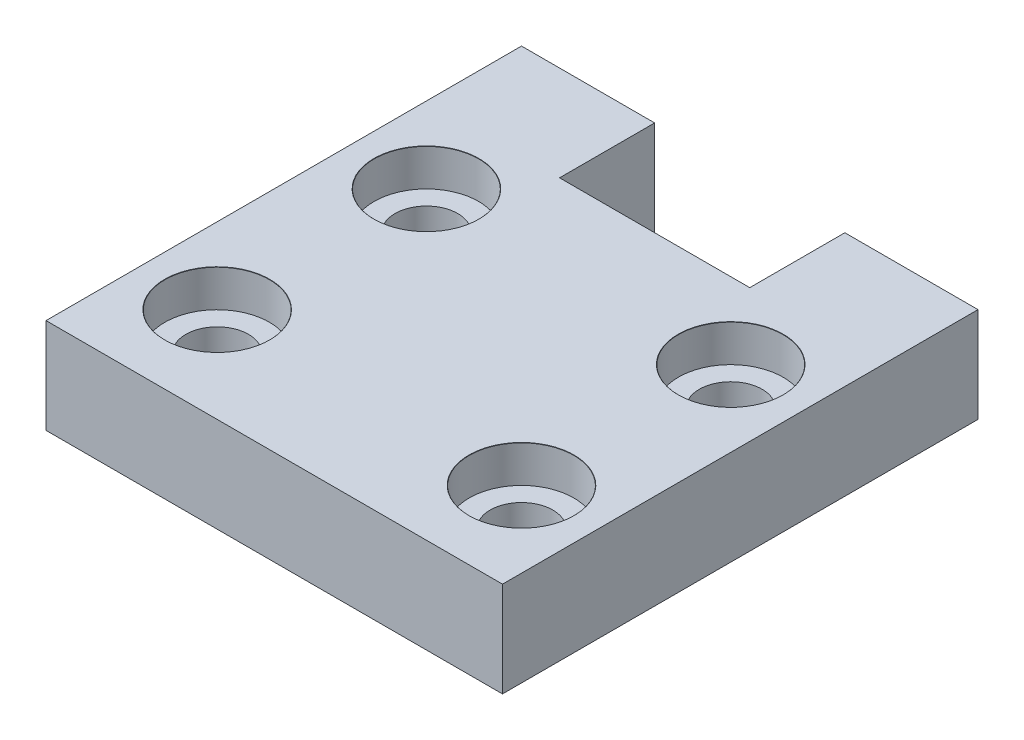
ISO-10303-21;
HEADER;
FILE_DESCRIPTION(('STEP AP214'),'2;1');
FILE_NAME('part.step','',(''),(''),'','','');
FILE_SCHEMA(('AUTOMOTIVE_DESIGN { 1 0 10303 214 1 1 1 1 }'));
ENDSEC;
DATA;
#1=APPLICATION_CONTEXT('core data for automotive mechanical design processes');
#2=APPLICATION_PROTOCOL_DEFINITION('international standard','automotive_design',2000,#1);
#3=PRODUCT_CONTEXT('',#1,'mechanical');
#4=PRODUCT('Part','Part','',(#3));
#5=PRODUCT_RELATED_PRODUCT_CATEGORY('part','',(#4));
#6=PRODUCT_DEFINITION_FORMATION('','',#4);
#7=PRODUCT_DEFINITION_CONTEXT('part definition',#1,'design');
#8=PRODUCT_DEFINITION('design','',#6,#7);
#9=PRODUCT_DEFINITION_SHAPE('','',#8);
#10=(LENGTH_UNIT() NAMED_UNIT(*) SI_UNIT(.MILLI.,.METRE.));
#11=(NAMED_UNIT(*) PLANE_ANGLE_UNIT() SI_UNIT($,.RADIAN.));
#12=(NAMED_UNIT(*) SI_UNIT($,.STERADIAN.) SOLID_ANGLE_UNIT());
#13=UNCERTAINTY_MEASURE_WITH_UNIT(LENGTH_MEASURE(1.E-05),#10,'distance_accuracy_value','');
#14=(GEOMETRIC_REPRESENTATION_CONTEXT(3) GLOBAL_UNCERTAINTY_ASSIGNED_CONTEXT((#13)) GLOBAL_UNIT_ASSIGNED_CONTEXT((#10,
#11,#12)) REPRESENTATION_CONTEXT('',''));
#15=CARTESIAN_POINT('',(0.,0.,0.));
#16=DIRECTION('',(0.,0.,1.));
#17=DIRECTION('',(1.,0.,0.));
#18=AXIS2_PLACEMENT_3D('',#15,#16,#17);
#19=CARTESIAN_POINT('',(-24.,10.,-25.));
#20=DIRECTION('',(0.,0.,1.));
#21=DIRECTION('',(1.,0.,0.));
#22=AXIS2_PLACEMENT_3D('',#19,#20,#21);
#23=PLANE('',#22);
#24=DIRECTION('',(-1.,0.,0.));
#25=VECTOR('',#24,1.);
#26=CARTESIAN_POINT('',(-24.,0.,-25.));
#27=LINE('',#26,#25);
#28=CARTESIAN_POINT('',(24.,0.,-25.));
#29=VERTEX_POINT('',#28);
#30=CARTESIAN_POINT('',(10.,0.,-25.));
#31=VERTEX_POINT('',#30);
#32=EDGE_CURVE('E152',#29,#31,#27,.T.);
#33=ORIENTED_EDGE('',*,*,#32,.T.);
#34=DIRECTION('',(0.,1.,0.));
#35=VECTOR('',#34,1.);
#36=CARTESIAN_POINT('',(9.99999999999999,10.,-25.));
#37=LINE('',#36,#35);
#38=CARTESIAN_POINT('',(10.,10.,-25.));
#39=VERTEX_POINT('',#38);
#40=EDGE_CURVE('E121',#31,#39,#37,.T.);
#41=ORIENTED_EDGE('',*,*,#40,.T.);
#42=DIRECTION('',(-1.,0.,0.));
#43=VECTOR('',#42,1.);
#44=CARTESIAN_POINT('',(-24.,10.,-25.));
#45=LINE('',#44,#43);
#46=CARTESIAN_POINT('',(24.,10.,-25.));
#47=VERTEX_POINT('',#46);
#48=EDGE_CURVE('E86',#47,#39,#45,.T.);
#49=ORIENTED_EDGE('',*,*,#48,.F.);
#50=DIRECTION('',(0.,-1.,0.));
#51=VECTOR('',#50,1.);
#52=CARTESIAN_POINT('',(24.,10.,-25.));
#53=LINE('',#52,#51);
#54=EDGE_CURVE('E41',#47,#29,#53,.T.);
#55=ORIENTED_EDGE('',*,*,#54,.T.);
#56=EDGE_LOOP('',(#33,#41,#49,#55));
#57=FACE_BOUND('',#56,.T.);
#58=ADVANCED_FACE('F33',(#57),#23,.F.);
#59=CARTESIAN_POINT('',(24.,10.,-25.));
#60=DIRECTION('',(-1.,0.,0.));
#61=DIRECTION('',(0.,0.,1.));
#62=AXIS2_PLACEMENT_3D('',#59,#60,#61);
#63=PLANE('',#62);
#64=DIRECTION('',(0.,0.,-1.));
#65=VECTOR('',#64,1.);
#66=CARTESIAN_POINT('',(24.,0.,-25.));
#67=LINE('',#66,#65);
#68=CARTESIAN_POINT('',(24.,0.,25.));
#69=VERTEX_POINT('',#68);
#70=EDGE_CURVE('E140',#69,#29,#67,.T.);
#71=ORIENTED_EDGE('',*,*,#70,.T.);
#72=ORIENTED_EDGE('',*,*,#54,.F.);
#73=DIRECTION('',(0.,0.,-1.));
#74=VECTOR('',#73,1.);
#75=CARTESIAN_POINT('',(24.,10.,-25.));
#76=LINE('',#75,#74);
#77=CARTESIAN_POINT('',(24.,10.,25.));
#78=VERTEX_POINT('',#77);
#79=EDGE_CURVE('E141',#78,#47,#76,.T.);
#80=ORIENTED_EDGE('',*,*,#79,.F.);
#81=DIRECTION('',(0.,-1.,0.));
#82=VECTOR('',#81,1.);
#83=CARTESIAN_POINT('',(24.,10.,25.));
#84=LINE('',#83,#82);
#85=EDGE_CURVE('E148',#78,#69,#84,.T.);
#86=ORIENTED_EDGE('',*,*,#85,.T.);
#87=EDGE_LOOP('',(#71,#72,#80,#86));
#88=FACE_BOUND('',#87,.T.);
#89=ADVANCED_FACE('F35',(#88),#63,.F.);
#90=CARTESIAN_POINT('',(-10.,10.,-25.));
#91=VERTEX_POINT('',#90);
#92=CARTESIAN_POINT('',(-24.,10.,-25.));
#93=VERTEX_POINT('',#92);
#94=EDGE_CURVE('E143',#91,#93,#45,.T.);
#95=ORIENTED_EDGE('',*,*,#94,.F.);
#96=DIRECTION('',(0.,-1.,0.));
#97=VECTOR('',#96,1.);
#98=CARTESIAN_POINT('',(-10.,10.,-25.));
#99=LINE('',#98,#97);
#100=CARTESIAN_POINT('',(-10.,0.,-25.));
#101=VERTEX_POINT('',#100);
#102=EDGE_CURVE('E115',#91,#101,#99,.T.);
#103=ORIENTED_EDGE('',*,*,#102,.T.);
#104=CARTESIAN_POINT('',(-24.,0.,-25.));
#105=VERTEX_POINT('',#104);
#106=EDGE_CURVE('E151',#101,#105,#27,.T.);
#107=ORIENTED_EDGE('',*,*,#106,.T.);
#108=DIRECTION('',(0.,-1.,0.));
#109=VECTOR('',#108,1.);
#110=CARTESIAN_POINT('',(-24.,10.,-25.));
#111=LINE('',#110,#109);
#112=EDGE_CURVE('E160',#93,#105,#111,.T.);
#113=ORIENTED_EDGE('',*,*,#112,.F.);
#114=EDGE_LOOP('',(#95,#103,#107,#113));
#115=FACE_BOUND('',#114,.T.);
#116=ADVANCED_FACE('F178',(#115),#23,.F.);
#117=CARTESIAN_POINT('',(-24.,10.,-25.));
#118=DIRECTION('',(1.,0.,0.));
#119=DIRECTION('',(0.,0.,-1.));
#120=AXIS2_PLACEMENT_3D('',#117,#118,#119);
#121=PLANE('',#120);
#122=DIRECTION('',(0.,0.,1.));
#123=VECTOR('',#122,1.);
#124=CARTESIAN_POINT('',(-24.,0.,-25.));
#125=LINE('',#124,#123);
#126=CARTESIAN_POINT('',(-24.,0.,25.));
#127=VERTEX_POINT('',#126);
#128=EDGE_CURVE('E154',#105,#127,#125,.T.);
#129=ORIENTED_EDGE('',*,*,#128,.T.);
#130=DIRECTION('',(0.,-1.,0.));
#131=VECTOR('',#130,1.);
#132=CARTESIAN_POINT('',(-24.,10.,25.));
#133=LINE('',#132,#131);
#134=CARTESIAN_POINT('',(-24.,10.,25.));
#135=VERTEX_POINT('',#134);
#136=EDGE_CURVE('E158',#135,#127,#133,.T.);
#137=ORIENTED_EDGE('',*,*,#136,.F.);
#138=DIRECTION('',(0.,0.,1.));
#139=VECTOR('',#138,1.);
#140=CARTESIAN_POINT('',(-24.,10.,-25.));
#141=LINE('',#140,#139);
#142=EDGE_CURVE('E145',#93,#135,#141,.T.);
#143=ORIENTED_EDGE('',*,*,#142,.F.);
#144=ORIENTED_EDGE('',*,*,#112,.T.);
#145=EDGE_LOOP('',(#129,#137,#143,#144));
#146=FACE_BOUND('',#145,.T.);
#147=ADVANCED_FACE('F169',(#146),#121,.F.);
#148=CARTESIAN_POINT('',(-24.,10.,25.));
#149=DIRECTION('',(0.,0.,-1.));
#150=DIRECTION('',(-1.,0.,0.));
#151=AXIS2_PLACEMENT_3D('',#148,#149,#150);
#152=PLANE('',#151);
#153=DIRECTION('',(1.,0.,0.));
#154=VECTOR('',#153,1.);
#155=CARTESIAN_POINT('',(-24.,0.,25.));
#156=LINE('',#155,#154);
#157=EDGE_CURVE('E78',#127,#69,#156,.T.);
#158=ORIENTED_EDGE('',*,*,#157,.T.);
#159=ORIENTED_EDGE('',*,*,#85,.F.);
#160=DIRECTION('',(1.,0.,0.));
#161=VECTOR('',#160,1.);
#162=CARTESIAN_POINT('',(-24.,10.,25.));
#163=LINE('',#162,#161);
#164=EDGE_CURVE('E57',#135,#78,#163,.T.);
#165=ORIENTED_EDGE('',*,*,#164,.F.);
#166=ORIENTED_EDGE('',*,*,#136,.T.);
#167=EDGE_LOOP('',(#158,#159,#165,#166));
#168=FACE_BOUND('',#167,.T.);
#169=ADVANCED_FACE('F172',(#168),#152,.F.);
#170=CARTESIAN_POINT('',(0.,10.,0.));
#171=DIRECTION('',(0.,1.,0.));
#172=DIRECTION('',(0.,0.,1.));
#173=AXIS2_PLACEMENT_3D('',#170,#171,#172);
#174=PLANE('',#173);
#175=CARTESIAN_POINT('',(-16.,10.,-7.));
#176=DIRECTION('',(0.,1.,0.));
#177=DIRECTION('',(0.,0.,1.));
#178=AXIS2_PLACEMENT_3D('',#175,#176,#177);
#179=CIRCLE('',#178,5.525);
#180=CARTESIAN_POINT('',(-16.,10.,-1.475));
#181=VERTEX_POINT('',#180);
#182=EDGE_CURVE('E213',#181,#181,#179,.T.);
#183=ORIENTED_EDGE('',*,*,#182,.F.);
#184=EDGE_LOOP('',(#183));
#185=FACE_BOUND('',#184,.T.);
#186=CARTESIAN_POINT('',(-16.,10.,15.));
#187=DIRECTION('',(0.,1.,0.));
#188=DIRECTION('',(0.,0.,1.));
#189=AXIS2_PLACEMENT_3D('',#186,#187,#188);
#190=CIRCLE('',#189,5.525);
#191=CARTESIAN_POINT('',(-16.,10.,20.525));
#192=VERTEX_POINT('',#191);
#193=EDGE_CURVE('E217',#192,#192,#190,.T.);
#194=ORIENTED_EDGE('',*,*,#193,.F.);
#195=EDGE_LOOP('',(#194));
#196=FACE_BOUND('',#195,.T.);
#197=CARTESIAN_POINT('',(16.,10.,15.));
#198=DIRECTION('',(0.,1.,0.));
#199=DIRECTION('',(0.,0.,1.));
#200=AXIS2_PLACEMENT_3D('',#197,#198,#199);
#201=CIRCLE('',#200,5.525);
#202=CARTESIAN_POINT('',(16.,10.,20.525));
#203=VERTEX_POINT('',#202);
#204=EDGE_CURVE('E221',#203,#203,#201,.T.);
#205=ORIENTED_EDGE('',*,*,#204,.F.);
#206=EDGE_LOOP('',(#205));
#207=FACE_BOUND('',#206,.T.);
#208=CARTESIAN_POINT('',(16.,10.,-7.00000000000001));
#209=DIRECTION('',(0.,1.,0.));
#210=DIRECTION('',(0.,0.,1.));
#211=AXIS2_PLACEMENT_3D('',#208,#209,#210);
#212=CIRCLE('',#211,5.525);
#213=CARTESIAN_POINT('',(16.,10.,-1.475));
#214=VERTEX_POINT('',#213);
#215=EDGE_CURVE('E224',#214,#214,#212,.T.);
#216=ORIENTED_EDGE('',*,*,#215,.F.);
#217=EDGE_LOOP('',(#216));
#218=FACE_BOUND('',#217,.T.);
#219=DIRECTION('',(0.,0.,-1.));
#220=VECTOR('',#219,1.);
#221=CARTESIAN_POINT('',(10.,10.,-35.));
#222=LINE('',#221,#220);
#223=CARTESIAN_POINT('',(10.,10.,-15.));
#224=VERTEX_POINT('',#223);
#225=EDGE_CURVE('E131',#224,#39,#222,.T.);
#226=ORIENTED_EDGE('',*,*,#225,.F.);
#227=DIRECTION('',(1.,0.,0.));
#228=VECTOR('',#227,1.);
#229=CARTESIAN_POINT('',(-10.,10.,-15.));
#230=LINE('',#229,#228);
#231=CARTESIAN_POINT('',(-10.,10.,-15.));
#232=VERTEX_POINT('',#231);
#233=EDGE_CURVE('E112',#232,#224,#230,.T.);
#234=ORIENTED_EDGE('',*,*,#233,.F.);
#235=DIRECTION('',(0.,0.,1.));
#236=VECTOR('',#235,1.);
#237=CARTESIAN_POINT('',(-10.,10.,-35.));
#238=LINE('',#237,#236);
#239=EDGE_CURVE('E133',#91,#232,#238,.T.);
#240=ORIENTED_EDGE('',*,*,#239,.F.);
#241=ORIENTED_EDGE('',*,*,#94,.T.);
#242=ORIENTED_EDGE('',*,*,#142,.T.);
#243=ORIENTED_EDGE('',*,*,#164,.T.);
#244=ORIENTED_EDGE('',*,*,#79,.T.);
#245=ORIENTED_EDGE('',*,*,#48,.T.);
#246=EDGE_LOOP('',(#226,#234,#240,#241,#242,#243,#244,#245));
#247=FACE_BOUND('',#246,.T.);
#248=ADVANCED_FACE('F173',(#185,#196,#207,#218,#247),#174,.T.);
#249=CARTESIAN_POINT('',(0.,0.,0.));
#250=DIRECTION('',(0.,1.,0.));
#251=DIRECTION('',(0.,0.,1.));
#252=AXIS2_PLACEMENT_3D('',#249,#250,#251);
#253=PLANE('',#252);
#254=CARTESIAN_POINT('',(-16.,0.,-7.));
#255=DIRECTION('',(0.,1.,0.));
#256=DIRECTION('',(0.,0.,1.));
#257=AXIS2_PLACEMENT_3D('',#254,#255,#256);
#258=CIRCLE('',#257,3.3);
#259=CARTESIAN_POINT('',(-16.,0.,-3.70000000000001));
#260=VERTEX_POINT('',#259);
#261=EDGE_CURVE('E330',#260,#260,#258,.T.);
#262=ORIENTED_EDGE('',*,*,#261,.T.);
#263=EDGE_LOOP('',(#262));
#264=FACE_BOUND('',#263,.T.);
#265=CARTESIAN_POINT('',(-16.,0.,15.));
#266=DIRECTION('',(0.,1.,0.));
#267=DIRECTION('',(0.,0.,1.));
#268=AXIS2_PLACEMENT_3D('',#265,#266,#267);
#269=CIRCLE('',#268,3.3);
#270=CARTESIAN_POINT('',(-16.,0.,18.3));
#271=VERTEX_POINT('',#270);
#272=EDGE_CURVE('E343',#271,#271,#269,.T.);
#273=ORIENTED_EDGE('',*,*,#272,.T.);
#274=EDGE_LOOP('',(#273));
#275=FACE_BOUND('',#274,.T.);
#276=CARTESIAN_POINT('',(16.,0.,15.));
#277=DIRECTION('',(0.,1.,0.));
#278=DIRECTION('',(0.,0.,1.));
#279=AXIS2_PLACEMENT_3D('',#276,#277,#278);
#280=CIRCLE('',#279,3.3);
#281=CARTESIAN_POINT('',(16.,0.,18.3));
#282=VERTEX_POINT('',#281);
#283=EDGE_CURVE('E227',#282,#282,#280,.T.);
#284=ORIENTED_EDGE('',*,*,#283,.T.);
#285=EDGE_LOOP('',(#284));
#286=FACE_BOUND('',#285,.T.);
#287=CARTESIAN_POINT('',(16.,0.,-7.00000000000001));
#288=DIRECTION('',(0.,1.,0.));
#289=DIRECTION('',(0.,0.,1.));
#290=AXIS2_PLACEMENT_3D('',#287,#288,#289);
#291=CIRCLE('',#290,3.3);
#292=CARTESIAN_POINT('',(16.,0.,-3.70000000000001));
#293=VERTEX_POINT('',#292);
#294=EDGE_CURVE('E134',#293,#293,#291,.T.);
#295=ORIENTED_EDGE('',*,*,#294,.T.);
#296=EDGE_LOOP('',(#295));
#297=FACE_BOUND('',#296,.T.);
#298=DIRECTION('',(1.,0.,0.));
#299=VECTOR('',#298,1.);
#300=CARTESIAN_POINT('',(-10.,0.,-15.));
#301=LINE('',#300,#299);
#302=CARTESIAN_POINT('',(-10.,0.,-15.));
#303=VERTEX_POINT('',#302);
#304=CARTESIAN_POINT('',(10.,0.,-15.));
#305=VERTEX_POINT('',#304);
#306=EDGE_CURVE('E48',#303,#305,#301,.T.);
#307=ORIENTED_EDGE('',*,*,#306,.T.);
#308=DIRECTION('',(0.,0.,-1.));
#309=VECTOR('',#308,1.);
#310=CARTESIAN_POINT('',(10.,0.,-35.));
#311=LINE('',#310,#309);
#312=EDGE_CURVE('E119',#305,#31,#311,.T.);
#313=ORIENTED_EDGE('',*,*,#312,.T.);
#314=ORIENTED_EDGE('',*,*,#32,.F.);
#315=ORIENTED_EDGE('',*,*,#70,.F.);
#316=ORIENTED_EDGE('',*,*,#157,.F.);
#317=ORIENTED_EDGE('',*,*,#128,.F.);
#318=ORIENTED_EDGE('',*,*,#106,.F.);
#319=DIRECTION('',(0.,0.,1.));
#320=VECTOR('',#319,1.);
#321=CARTESIAN_POINT('',(-10.,0.,0.));
#322=LINE('',#321,#320);
#323=EDGE_CURVE('E11',#101,#303,#322,.T.);
#324=ORIENTED_EDGE('',*,*,#323,.T.);
#325=EDGE_LOOP('',(#307,#313,#314,#315,#316,#317,#318,#324));
#326=FACE_BOUND('',#325,.T.);
#327=ADVANCED_FACE('F125',(#264,#275,#286,#297,#326),#253,.F.);
#328=CARTESIAN_POINT('',(10.,0.,-35.));
#329=DIRECTION('',(1.,0.,0.));
#330=DIRECTION('',(0.,0.,-1.));
#331=AXIS2_PLACEMENT_3D('',#328,#329,#330);
#332=PLANE('',#331);
#333=ORIENTED_EDGE('',*,*,#312,.F.);
#334=DIRECTION('',(0.,1.,0.));
#335=VECTOR('',#334,1.);
#336=CARTESIAN_POINT('',(10.,0.,-15.));
#337=LINE('',#336,#335);
#338=EDGE_CURVE('E108',#305,#224,#337,.T.);
#339=ORIENTED_EDGE('',*,*,#338,.T.);
#340=ORIENTED_EDGE('',*,*,#225,.T.);
#341=ORIENTED_EDGE('',*,*,#40,.F.);
#342=EDGE_LOOP('',(#333,#339,#340,#341));
#343=FACE_BOUND('',#342,.T.);
#344=ADVANCED_FACE('F120',(#343),#332,.F.);
#345=CARTESIAN_POINT('',(-10.,0.,-35.));
#346=DIRECTION('',(-1.,0.,0.));
#347=DIRECTION('',(0.,0.,1.));
#348=AXIS2_PLACEMENT_3D('',#345,#346,#347);
#349=PLANE('',#348);
#350=ORIENTED_EDGE('',*,*,#239,.T.);
#351=DIRECTION('',(0.,1.,0.));
#352=VECTOR('',#351,1.);
#353=CARTESIAN_POINT('',(-10.,0.,-15.));
#354=LINE('',#353,#352);
#355=EDGE_CURVE('E116',#303,#232,#354,.T.);
#356=ORIENTED_EDGE('',*,*,#355,.F.);
#357=ORIENTED_EDGE('',*,*,#323,.F.);
#358=ORIENTED_EDGE('',*,*,#102,.F.);
#359=EDGE_LOOP('',(#350,#356,#357,#358));
#360=FACE_BOUND('',#359,.T.);
#361=ADVANCED_FACE('F179',(#360),#349,.F.);
#362=CARTESIAN_POINT('',(-10.,0.,-15.));
#363=DIRECTION('',(0.,0.,1.));
#364=DIRECTION('',(1.,0.,0.));
#365=AXIS2_PLACEMENT_3D('',#362,#363,#364);
#366=PLANE('',#365);
#367=ORIENTED_EDGE('',*,*,#233,.T.);
#368=ORIENTED_EDGE('',*,*,#338,.F.);
#369=ORIENTED_EDGE('',*,*,#306,.F.);
#370=ORIENTED_EDGE('',*,*,#355,.T.);
#371=EDGE_LOOP('',(#367,#368,#369,#370));
#372=FACE_BOUND('',#371,.T.);
#373=ADVANCED_FACE('F110',(#372),#366,.F.);
#374=CARTESIAN_POINT('',(16.,10.,-7.00000000000001));
#375=DIRECTION('',(0.,1.,0.));
#376=DIRECTION('',(0.,0.,1.));
#377=AXIS2_PLACEMENT_3D('',#374,#375,#376);
#378=CYLINDRICAL_SURFACE('',#377,3.3);
#379=ORIENTED_EDGE('',*,*,#294,.F.);
#380=EDGE_LOOP('',(#379));
#381=FACE_BOUND('',#380,.T.);
#382=CARTESIAN_POINT('',(16.,6.1,-7.00000000000001));
#383=DIRECTION('',(0.,1.,0.));
#384=DIRECTION('',(0.,0.,1.));
#385=AXIS2_PLACEMENT_3D('',#382,#383,#384);
#386=CIRCLE('',#385,3.3);
#387=CARTESIAN_POINT('',(16.,6.1,-3.70000000000001));
#388=VERTEX_POINT('',#387);
#389=EDGE_CURVE('E239',#388,#388,#386,.T.);
#390=ORIENTED_EDGE('',*,*,#389,.T.);
#391=EDGE_LOOP('',(#390));
#392=FACE_BOUND('',#391,.T.);
#393=ADVANCED_FACE('F186',(#381,#392),#378,.F.);
#394=CARTESIAN_POINT('',(19.3,6.1,-7.00000000000001));
#395=DIRECTION('',(0.,-1.,0.));
#396=DIRECTION('',(0.,0.,-1.));
#397=AXIS2_PLACEMENT_3D('',#394,#395,#396);
#398=PLANE('',#397);
#399=ORIENTED_EDGE('',*,*,#389,.F.);
#400=EDGE_LOOP('',(#399));
#401=FACE_BOUND('',#400,.T.);
#402=CARTESIAN_POINT('',(16.,6.1,-7.00000000000001));
#403=DIRECTION('',(0.,1.,0.));
#404=DIRECTION('',(0.,0.,1.));
#405=AXIS2_PLACEMENT_3D('',#402,#403,#404);
#406=CIRCLE('',#405,5.5);
#407=CARTESIAN_POINT('',(16.,6.1,-1.50000000000001));
#408=VERTEX_POINT('',#407);
#409=EDGE_CURVE('E230',#408,#408,#406,.T.);
#410=ORIENTED_EDGE('',*,*,#409,.T.);
#411=EDGE_LOOP('',(#410));
#412=FACE_BOUND('',#411,.T.);
#413=ADVANCED_FACE('F247',(#401,#412),#398,.F.);
#414=CARTESIAN_POINT('',(16.,10.,-7.00000000000001));
#415=DIRECTION('',(0.,1.,0.));
#416=DIRECTION('',(0.,0.,1.));
#417=AXIS2_PLACEMENT_3D('',#414,#415,#416);
#418=CYLINDRICAL_SURFACE('',#417,5.5);
#419=ORIENTED_EDGE('',*,*,#409,.F.);
#420=EDGE_LOOP('',(#419));
#421=FACE_BOUND('',#420,.T.);
#422=CARTESIAN_POINT('',(16.,9.975,-7.00000000000001));
#423=DIRECTION('',(0.,1.,0.));
#424=DIRECTION('',(0.,0.,1.));
#425=AXIS2_PLACEMENT_3D('',#422,#423,#424);
#426=CIRCLE('',#425,5.5);
#427=CARTESIAN_POINT('',(16.,9.975,-1.50000000000001));
#428=VERTEX_POINT('',#427);
#429=EDGE_CURVE('E226',#428,#428,#426,.T.);
#430=ORIENTED_EDGE('',*,*,#429,.T.);
#431=EDGE_LOOP('',(#430));
#432=FACE_BOUND('',#431,.T.);
#433=ADVANCED_FACE('F253',(#421,#432),#418,.F.);
#434=CARTESIAN_POINT('',(16.,10.,-7.00000000000001));
#435=DIRECTION('',(0.,1.,0.));
#436=DIRECTION('',(0.,0.,1.));
#437=AXIS2_PLACEMENT_3D('',#434,#435,#436);
#438=CONICAL_SURFACE('',#437,5.525,0.785398163397518);
#439=ORIENTED_EDGE('',*,*,#429,.F.);
#440=EDGE_LOOP('',(#439));
#441=FACE_BOUND('',#440,.T.);
#442=ORIENTED_EDGE('',*,*,#215,.T.);
#443=EDGE_LOOP('',(#442));
#444=FACE_BOUND('',#443,.T.);
#445=ADVANCED_FACE('F259',(#441,#444),#438,.F.);
#446=CARTESIAN_POINT('',(16.,10.,15.));
#447=DIRECTION('',(0.,1.,0.));
#448=DIRECTION('',(0.,0.,1.));
#449=AXIS2_PLACEMENT_3D('',#446,#447,#448);
#450=CYLINDRICAL_SURFACE('',#449,3.3);
#451=ORIENTED_EDGE('',*,*,#283,.F.);
#452=EDGE_LOOP('',(#451));
#453=FACE_BOUND('',#452,.T.);
#454=CARTESIAN_POINT('',(16.,6.1,15.));
#455=DIRECTION('',(0.,1.,0.));
#456=DIRECTION('',(0.,0.,1.));
#457=AXIS2_PLACEMENT_3D('',#454,#455,#456);
#458=CIRCLE('',#457,3.3);
#459=CARTESIAN_POINT('',(16.,6.1,18.3));
#460=VERTEX_POINT('',#459);
#461=EDGE_CURVE('E233',#460,#460,#458,.T.);
#462=ORIENTED_EDGE('',*,*,#461,.T.);
#463=EDGE_LOOP('',(#462));
#464=FACE_BOUND('',#463,.T.);
#465=ADVANCED_FACE('F264',(#453,#464),#450,.F.);
#466=CARTESIAN_POINT('',(19.3,6.1,15.));
#467=DIRECTION('',(0.,-1.,0.));
#468=DIRECTION('',(0.,0.,-1.));
#469=AXIS2_PLACEMENT_3D('',#466,#467,#468);
#470=PLANE('',#469);
#471=ORIENTED_EDGE('',*,*,#461,.F.);
#472=EDGE_LOOP('',(#471));
#473=FACE_BOUND('',#472,.T.);
#474=CARTESIAN_POINT('',(16.,6.1,15.));
#475=DIRECTION('',(0.,1.,0.));
#476=DIRECTION('',(0.,0.,1.));
#477=AXIS2_PLACEMENT_3D('',#474,#475,#476);
#478=CIRCLE('',#477,5.5);
#479=CARTESIAN_POINT('',(16.,6.1,20.5));
#480=VERTEX_POINT('',#479);
#481=EDGE_CURVE('E350',#480,#480,#478,.T.);
#482=ORIENTED_EDGE('',*,*,#481,.T.);
#483=EDGE_LOOP('',(#482));
#484=FACE_BOUND('',#483,.T.);
#485=ADVANCED_FACE('F269',(#473,#484),#470,.F.);
#486=CARTESIAN_POINT('',(16.,10.,15.));
#487=DIRECTION('',(0.,1.,0.));
#488=DIRECTION('',(0.,0.,1.));
#489=AXIS2_PLACEMENT_3D('',#486,#487,#488);
#490=CYLINDRICAL_SURFACE('',#489,5.5);
#491=ORIENTED_EDGE('',*,*,#481,.F.);
#492=EDGE_LOOP('',(#491));
#493=FACE_BOUND('',#492,.T.);
#494=CARTESIAN_POINT('',(16.,9.975,15.));
#495=DIRECTION('',(0.,1.,0.));
#496=DIRECTION('',(0.,0.,1.));
#497=AXIS2_PLACEMENT_3D('',#494,#495,#496);
#498=CIRCLE('',#497,5.5);
#499=CARTESIAN_POINT('',(16.,9.975,20.5));
#500=VERTEX_POINT('',#499);
#501=EDGE_CURVE('E347',#500,#500,#498,.T.);
#502=ORIENTED_EDGE('',*,*,#501,.T.);
#503=EDGE_LOOP('',(#502));
#504=FACE_BOUND('',#503,.T.);
#505=ADVANCED_FACE('F275',(#493,#504),#490,.F.);
#506=CARTESIAN_POINT('',(16.,10.,15.));
#507=DIRECTION('',(0.,1.,0.));
#508=DIRECTION('',(0.,0.,1.));
#509=AXIS2_PLACEMENT_3D('',#506,#507,#508);
#510=CONICAL_SURFACE('',#509,5.525,0.785398163397518);
#511=ORIENTED_EDGE('',*,*,#501,.F.);
#512=EDGE_LOOP('',(#511));
#513=FACE_BOUND('',#512,.T.);
#514=ORIENTED_EDGE('',*,*,#204,.T.);
#515=EDGE_LOOP('',(#514));
#516=FACE_BOUND('',#515,.T.);
#517=ADVANCED_FACE('F279',(#513,#516),#510,.F.);
#518=CARTESIAN_POINT('',(-16.,10.,15.));
#519=DIRECTION('',(0.,1.,0.));
#520=DIRECTION('',(0.,0.,1.));
#521=AXIS2_PLACEMENT_3D('',#518,#519,#520);
#522=CYLINDRICAL_SURFACE('',#521,3.3);
#523=ORIENTED_EDGE('',*,*,#272,.F.);
#524=EDGE_LOOP('',(#523));
#525=FACE_BOUND('',#524,.T.);
#526=CARTESIAN_POINT('',(-16.,6.1,15.));
#527=DIRECTION('',(0.,1.,0.));
#528=DIRECTION('',(0.,0.,1.));
#529=AXIS2_PLACEMENT_3D('',#526,#527,#528);
#530=CIRCLE('',#529,3.3);
#531=CARTESIAN_POINT('',(-16.,6.1,18.3));
#532=VERTEX_POINT('',#531);
#533=EDGE_CURVE('E340',#532,#532,#530,.T.);
#534=ORIENTED_EDGE('',*,*,#533,.T.);
#535=EDGE_LOOP('',(#534));
#536=FACE_BOUND('',#535,.T.);
#537=ADVANCED_FACE('F283',(#525,#536),#522,.F.);
#538=CARTESIAN_POINT('',(-12.7,6.1,15.));
#539=DIRECTION('',(0.,-1.,0.));
#540=DIRECTION('',(0.,0.,-1.));
#541=AXIS2_PLACEMENT_3D('',#538,#539,#540);
#542=PLANE('',#541);
#543=ORIENTED_EDGE('',*,*,#533,.F.);
#544=EDGE_LOOP('',(#543));
#545=FACE_BOUND('',#544,.T.);
#546=CARTESIAN_POINT('',(-16.,6.1,15.));
#547=DIRECTION('',(0.,1.,0.));
#548=DIRECTION('',(0.,0.,1.));
#549=AXIS2_PLACEMENT_3D('',#546,#547,#548);
#550=CIRCLE('',#549,5.5);
#551=CARTESIAN_POINT('',(-16.,6.1,20.5));
#552=VERTEX_POINT('',#551);
#553=EDGE_CURVE('E337',#552,#552,#550,.T.);
#554=ORIENTED_EDGE('',*,*,#553,.T.);
#555=EDGE_LOOP('',(#554));
#556=FACE_BOUND('',#555,.T.);
#557=ADVANCED_FACE('F287',(#545,#556),#542,.F.);
#558=CARTESIAN_POINT('',(-16.,10.,15.));
#559=DIRECTION('',(0.,1.,0.));
#560=DIRECTION('',(0.,0.,1.));
#561=AXIS2_PLACEMENT_3D('',#558,#559,#560);
#562=CYLINDRICAL_SURFACE('',#561,5.5);
#563=ORIENTED_EDGE('',*,*,#553,.F.);
#564=EDGE_LOOP('',(#563));
#565=FACE_BOUND('',#564,.T.);
#566=CARTESIAN_POINT('',(-16.,9.975,15.));
#567=DIRECTION('',(0.,1.,0.));
#568=DIRECTION('',(0.,0.,1.));
#569=AXIS2_PLACEMENT_3D('',#566,#567,#568);
#570=CIRCLE('',#569,5.5);
#571=CARTESIAN_POINT('',(-16.,9.975,20.5));
#572=VERTEX_POINT('',#571);
#573=EDGE_CURVE('E334',#572,#572,#570,.T.);
#574=ORIENTED_EDGE('',*,*,#573,.T.);
#575=EDGE_LOOP('',(#574));
#576=FACE_BOUND('',#575,.T.);
#577=ADVANCED_FACE('F291',(#565,#576),#562,.F.);
#578=CARTESIAN_POINT('',(-16.,10.,15.));
#579=DIRECTION('',(0.,1.,0.));
#580=DIRECTION('',(0.,0.,1.));
#581=AXIS2_PLACEMENT_3D('',#578,#579,#580);
#582=CONICAL_SURFACE('',#581,5.525,0.785398163397483);
#583=ORIENTED_EDGE('',*,*,#573,.F.);
#584=EDGE_LOOP('',(#583));
#585=FACE_BOUND('',#584,.T.);
#586=ORIENTED_EDGE('',*,*,#193,.T.);
#587=EDGE_LOOP('',(#586));
#588=FACE_BOUND('',#587,.T.);
#589=ADVANCED_FACE('F295',(#585,#588),#582,.F.);
#590=CARTESIAN_POINT('',(-16.,10.,-7.));
#591=DIRECTION('',(0.,1.,0.));
#592=DIRECTION('',(0.,0.,1.));
#593=AXIS2_PLACEMENT_3D('',#590,#591,#592);
#594=CYLINDRICAL_SURFACE('',#593,3.3);
#595=ORIENTED_EDGE('',*,*,#261,.F.);
#596=EDGE_LOOP('',(#595));
#597=FACE_BOUND('',#596,.T.);
#598=CARTESIAN_POINT('',(-16.,6.1,-7.));
#599=DIRECTION('',(0.,1.,0.));
#600=DIRECTION('',(0.,0.,1.));
#601=AXIS2_PLACEMENT_3D('',#598,#599,#600);
#602=CIRCLE('',#601,3.3);
#603=CARTESIAN_POINT('',(-16.,6.1,-3.70000000000001));
#604=VERTEX_POINT('',#603);
#605=EDGE_CURVE('E327',#604,#604,#602,.T.);
#606=ORIENTED_EDGE('',*,*,#605,.T.);
#607=EDGE_LOOP('',(#606));
#608=FACE_BOUND('',#607,.T.);
#609=ADVANCED_FACE('F299',(#597,#608),#594,.F.);
#610=CARTESIAN_POINT('',(-12.7,6.1,-7.));
#611=DIRECTION('',(0.,-1.,0.));
#612=DIRECTION('',(0.,0.,-1.));
#613=AXIS2_PLACEMENT_3D('',#610,#611,#612);
#614=PLANE('',#613);
#615=ORIENTED_EDGE('',*,*,#605,.F.);
#616=EDGE_LOOP('',(#615));
#617=FACE_BOUND('',#616,.T.);
#618=CARTESIAN_POINT('',(-16.,6.1,-7.));
#619=DIRECTION('',(0.,1.,0.));
#620=DIRECTION('',(0.,0.,1.));
#621=AXIS2_PLACEMENT_3D('',#618,#619,#620);
#622=CIRCLE('',#621,5.5);
#623=CARTESIAN_POINT('',(-16.,6.1,-1.5));
#624=VERTEX_POINT('',#623);
#625=EDGE_CURVE('E322',#624,#624,#622,.T.);
#626=ORIENTED_EDGE('',*,*,#625,.T.);
#627=EDGE_LOOP('',(#626));
#628=FACE_BOUND('',#627,.T.);
#629=ADVANCED_FACE('F303',(#617,#628),#614,.F.);
#630=CARTESIAN_POINT('',(-16.,10.,-7.));
#631=DIRECTION('',(0.,1.,0.));
#632=DIRECTION('',(0.,0.,1.));
#633=AXIS2_PLACEMENT_3D('',#630,#631,#632);
#634=CYLINDRICAL_SURFACE('',#633,5.5);
#635=ORIENTED_EDGE('',*,*,#625,.F.);
#636=EDGE_LOOP('',(#635));
#637=FACE_BOUND('',#636,.T.);
#638=CARTESIAN_POINT('',(-16.,9.975,-7.));
#639=DIRECTION('',(0.,1.,0.));
#640=DIRECTION('',(0.,0.,1.));
#641=AXIS2_PLACEMENT_3D('',#638,#639,#640);
#642=CIRCLE('',#641,5.5);
#643=CARTESIAN_POINT('',(-16.,9.975,-1.5));
#644=VERTEX_POINT('',#643);
#645=EDGE_CURVE('E320',#644,#644,#642,.T.);
#646=ORIENTED_EDGE('',*,*,#645,.T.);
#647=EDGE_LOOP('',(#646));
#648=FACE_BOUND('',#647,.T.);
#649=ADVANCED_FACE('F307',(#637,#648),#634,.F.);
#650=CARTESIAN_POINT('',(-16.,10.,-7.));
#651=DIRECTION('',(0.,1.,0.));
#652=DIRECTION('',(0.,0.,1.));
#653=AXIS2_PLACEMENT_3D('',#650,#651,#652);
#654=CONICAL_SURFACE('',#653,5.525,0.785398163397483);
#655=ORIENTED_EDGE('',*,*,#645,.F.);
#656=EDGE_LOOP('',(#655));
#657=FACE_BOUND('',#656,.T.);
#658=ORIENTED_EDGE('',*,*,#182,.T.);
#659=EDGE_LOOP('',(#658));
#660=FACE_BOUND('',#659,.T.);
#661=ADVANCED_FACE('F311',(#657,#660),#654,.F.);
#662=CLOSED_SHELL('',(#58,#89,#116,#147,#169,#248,#327,#344,#361,#373,#393,#413,#433,#445,#465,
#485,#505,#517,#537,#557,#577,#589,#609,#629,#649,#661));
#663=MANIFOLD_SOLID_BREP('B2',#662);
#664=ADVANCED_BREP_SHAPE_REPRESENTATION('',(#18,#663),#14);
#665=SHAPE_DEFINITION_REPRESENTATION(#9,#664);
ENDSEC;
END-ISO-10303-21;
